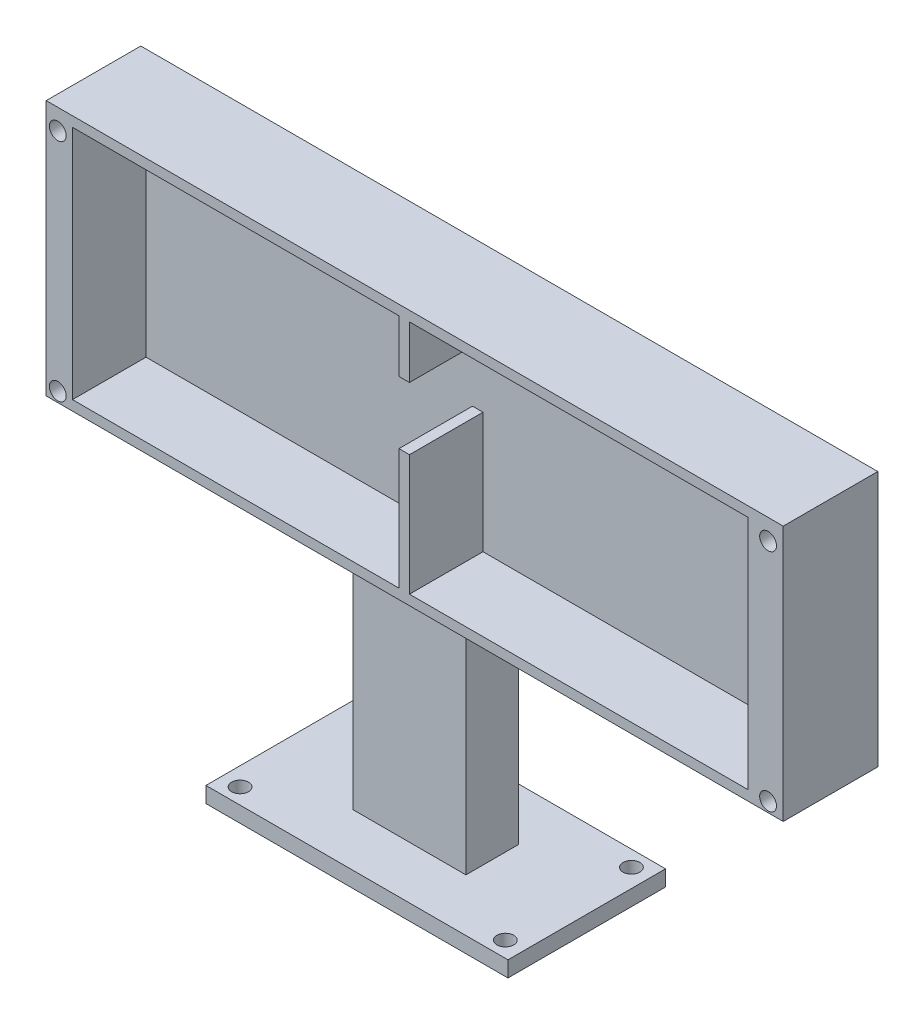
ISO-10303-21;
HEADER;
FILE_DESCRIPTION(('STEP AP214'),'2;1');
FILE_NAME('part.step','',(''),(''),'','','');
FILE_SCHEMA(('AUTOMOTIVE_DESIGN { 1 0 10303 214 1 1 1 1 }'));
ENDSEC;
DATA;
#1=APPLICATION_CONTEXT('core data for automotive mechanical design processes');
#2=APPLICATION_PROTOCOL_DEFINITION('international standard','automotive_design',2000,#1);
#3=PRODUCT_CONTEXT('',#1,'mechanical');
#4=PRODUCT('Part','Part','',(#3));
#5=PRODUCT_RELATED_PRODUCT_CATEGORY('part','',(#4));
#6=PRODUCT_DEFINITION_FORMATION('','',#4);
#7=PRODUCT_DEFINITION_CONTEXT('part definition',#1,'design');
#8=PRODUCT_DEFINITION('design','',#6,#7);
#9=PRODUCT_DEFINITION_SHAPE('','',#8);
#10=(LENGTH_UNIT() NAMED_UNIT(*) SI_UNIT(.MILLI.,.METRE.));
#11=(NAMED_UNIT(*) PLANE_ANGLE_UNIT() SI_UNIT($,.RADIAN.));
#12=(NAMED_UNIT(*) SI_UNIT($,.STERADIAN.) SOLID_ANGLE_UNIT());
#13=UNCERTAINTY_MEASURE_WITH_UNIT(LENGTH_MEASURE(1.E-05),#10,'distance_accuracy_value','');
#14=(GEOMETRIC_REPRESENTATION_CONTEXT(3) GLOBAL_UNCERTAINTY_ASSIGNED_CONTEXT((#13)) GLOBAL_UNIT_ASSIGNED_CONTEXT((#10,
#11,#12)) REPRESENTATION_CONTEXT('',''));
#15=CARTESIAN_POINT('',(0.,0.,0.));
#16=DIRECTION('',(0.,0.,1.));
#17=DIRECTION('',(1.,0.,0.));
#18=AXIS2_PLACEMENT_3D('',#15,#16,#17);
#19=CARTESIAN_POINT('',(0.,0.,-8.));
#20=DIRECTION('',(0.,0.,1.));
#21=DIRECTION('',(1.,0.,0.));
#22=AXIS2_PLACEMENT_3D('',#19,#20,#21);
#23=PLANE('',#22);
#24=DIRECTION('',(1.,0.,0.));
#25=VECTOR('',#24,1.);
#26=CARTESIAN_POINT('',(0.,89.8,-8.));
#27=LINE('',#26,#25);
#28=CARTESIAN_POINT('',(-9.75000000000002,89.8,-8.));
#29=VERTEX_POINT('',#28);
#30=CARTESIAN_POINT('',(54.7155818833901,89.8,-8.));
#31=VERTEX_POINT('',#30);
#32=EDGE_CURVE('E230',#29,#31,#27,.T.);
#33=ORIENTED_EDGE('',*,*,#32,.F.);
#34=DIRECTION('',(0.,-1.,0.));
#35=VECTOR('',#34,1.);
#36=CARTESIAN_POINT('',(-9.75000000000001,0.,-8.));
#37=LINE('',#36,#35);
#38=CARTESIAN_POINT('',(-9.75000000000002,79.8,-8.));
#39=VERTEX_POINT('',#38);
#40=EDGE_CURVE('E378',#29,#39,#37,.T.);
#41=ORIENTED_EDGE('',*,*,#40,.T.);
#42=DIRECTION('',(-1.,0.,0.));
#43=VECTOR('',#42,1.);
#44=CARTESIAN_POINT('',(11.25,79.8,-8.));
#45=LINE('',#44,#43);
#46=CARTESIAN_POINT('',(-11.75,79.8,-8.));
#47=VERTEX_POINT('',#46);
#48=EDGE_CURVE('E318',#39,#47,#45,.T.);
#49=ORIENTED_EDGE('',*,*,#48,.T.);
#50=DIRECTION('',(0.,-1.,0.));
#51=VECTOR('',#50,1.);
#52=CARTESIAN_POINT('',(-11.75,0.,-8.));
#53=LINE('',#52,#51);
#54=CARTESIAN_POINT('',(-11.75,89.8,-8.));
#55=VERTEX_POINT('',#54);
#56=EDGE_CURVE('E362',#55,#47,#53,.T.);
#57=ORIENTED_EDGE('',*,*,#56,.F.);
#58=CARTESIAN_POINT('',(-73.9,89.8,-8.));
#59=VERTEX_POINT('',#58);
#60=EDGE_CURVE('E223',#59,#55,#27,.T.);
#61=ORIENTED_EDGE('',*,*,#60,.F.);
#62=DIRECTION('',(0.,-1.,0.));
#63=VECTOR('',#62,1.);
#64=CARTESIAN_POINT('',(-73.9,0.,-8.));
#65=LINE('',#64,#63);
#66=CARTESIAN_POINT('',(-73.9,44.9,-8.));
#67=VERTEX_POINT('',#66);
#68=EDGE_CURVE('E364',#59,#67,#65,.T.);
#69=ORIENTED_EDGE('',*,*,#68,.T.);
#70=DIRECTION('',(1.,0.,0.));
#71=VECTOR('',#70,1.);
#72=CARTESIAN_POINT('',(0.,44.9,-8.));
#73=LINE('',#72,#71);
#74=CARTESIAN_POINT('',(-11.75,44.9,-8.));
#75=VERTEX_POINT('',#74);
#76=EDGE_CURVE('E368',#67,#75,#73,.T.);
#77=ORIENTED_EDGE('',*,*,#76,.T.);
#78=CARTESIAN_POINT('',(-11.75,67.9,-8.));
#79=VERTEX_POINT('',#78);
#80=EDGE_CURVE('E365',#79,#75,#53,.T.);
#81=ORIENTED_EDGE('',*,*,#80,.F.);
#82=DIRECTION('',(-1.,0.,0.));
#83=VECTOR('',#82,1.);
#84=CARTESIAN_POINT('',(11.25,67.9,-8.));
#85=LINE('',#84,#83);
#86=CARTESIAN_POINT('',(-9.75000000000001,67.9,-8.));
#87=VERTEX_POINT('',#86);
#88=EDGE_CURVE('E65',#87,#79,#85,.T.);
#89=ORIENTED_EDGE('',*,*,#88,.F.);
#90=CARTESIAN_POINT('',(-9.75000000000001,44.9,-8.));
#91=VERTEX_POINT('',#90);
#92=EDGE_CURVE('E361',#87,#91,#37,.T.);
#93=ORIENTED_EDGE('',*,*,#92,.T.);
#94=DIRECTION('',(1.,0.,0.));
#95=VECTOR('',#94,1.);
#96=CARTESIAN_POINT('',(0.,44.9,-8.));
#97=LINE('',#96,#95);
#98=CARTESIAN_POINT('',(54.7155818833901,44.9,-8.));
#99=VERTEX_POINT('',#98);
#100=EDGE_CURVE('E381',#91,#99,#97,.T.);
#101=ORIENTED_EDGE('',*,*,#100,.T.);
#102=DIRECTION('',(0.,-1.,0.));
#103=VECTOR('',#102,1.);
#104=CARTESIAN_POINT('',(54.7155818833901,0.,-8.));
#105=LINE('',#104,#103);
#106=EDGE_CURVE('E273',#31,#99,#105,.T.);
#107=ORIENTED_EDGE('',*,*,#106,.F.);
#108=EDGE_LOOP('',(#33,#41,#49,#57,#61,#69,#77,#81,#89,#93,#101,#107));
#109=FACE_BOUND('',#108,.T.);
#110=ADVANCED_FACE('F40',(#109),#23,.T.);
#111=CARTESIAN_POINT('',(0.,89.8,-8.));
#112=DIRECTION('',(0.,-1.,0.));
#113=DIRECTION('',(0.,0.,-1.));
#114=AXIS2_PLACEMENT_3D('',#111,#112,#113);
#115=PLANE('',#114);
#116=DIRECTION('',(1.,0.,0.));
#117=VECTOR('',#116,1.);
#118=CARTESIAN_POINT('',(0.,89.8,6.));
#119=LINE('',#118,#117);
#120=CARTESIAN_POINT('',(-9.75000000000002,89.8,6.));
#121=VERTEX_POINT('',#120);
#122=CARTESIAN_POINT('',(54.7155818833901,89.8,6.));
#123=VERTEX_POINT('',#122);
#124=EDGE_CURVE('E231',#121,#123,#119,.T.);
#125=ORIENTED_EDGE('',*,*,#124,.F.);
#126=DIRECTION('',(0.,0.,-1.));
#127=VECTOR('',#126,1.);
#128=CARTESIAN_POINT('',(-9.75000000000002,89.8,6.));
#129=LINE('',#128,#127);
#130=EDGE_CURVE('E224',#121,#29,#129,.T.);
#131=ORIENTED_EDGE('',*,*,#130,.T.);
#132=ORIENTED_EDGE('',*,*,#32,.T.);
#133=DIRECTION('',(0.,0.,1.));
#134=VECTOR('',#133,1.);
#135=CARTESIAN_POINT('',(54.7155818833901,89.8,-8.));
#136=LINE('',#135,#134);
#137=EDGE_CURVE('E240',#31,#123,#136,.T.);
#138=ORIENTED_EDGE('',*,*,#137,.T.);
#139=EDGE_LOOP('',(#125,#131,#132,#138));
#140=FACE_BOUND('',#139,.T.);
#141=ADVANCED_FACE('F455',(#140),#115,.T.);
#142=CARTESIAN_POINT('',(54.4,0.,6.));
#143=DIRECTION('',(0.,0.,1.));
#144=DIRECTION('',(1.,0.,0.));
#145=AXIS2_PLACEMENT_3D('',#142,#143,#144);
#146=PLANE('',#145);
#147=DIRECTION('',(0.,1.,0.));
#148=VECTOR('',#147,1.);
#149=CARTESIAN_POINT('',(-9.75000000000001,0.,6.));
#150=LINE('',#149,#148);
#151=CARTESIAN_POINT('',(-9.75000000000002,79.8,6.));
#152=VERTEX_POINT('',#151);
#153=EDGE_CURVE('E57',#152,#121,#150,.T.);
#154=ORIENTED_EDGE('',*,*,#153,.T.);
#155=ORIENTED_EDGE('',*,*,#124,.T.);
#156=DIRECTION('',(0.,-1.,0.));
#157=VECTOR('',#156,1.);
#158=CARTESIAN_POINT('',(54.7155818833901,0.,6.));
#159=LINE('',#158,#157);
#160=CARTESIAN_POINT('',(54.7155818833901,44.9,6.));
#161=VERTEX_POINT('',#160);
#162=EDGE_CURVE('E277',#123,#161,#159,.T.);
#163=ORIENTED_EDGE('',*,*,#162,.T.);
#164=DIRECTION('',(-1.,0.,0.));
#165=VECTOR('',#164,1.);
#166=CARTESIAN_POINT('',(0.,44.9,6.));
#167=LINE('',#166,#165);
#168=CARTESIAN_POINT('',(-9.75000000000001,44.9,6.));
#169=VERTEX_POINT('',#168);
#170=EDGE_CURVE('E339',#161,#169,#167,.T.);
#171=ORIENTED_EDGE('',*,*,#170,.T.);
#172=CARTESIAN_POINT('',(-9.75000000000001,67.9,6.));
#173=VERTEX_POINT('',#172);
#174=EDGE_CURVE('E336',#169,#173,#150,.T.);
#175=ORIENTED_EDGE('',*,*,#174,.T.);
#176=DIRECTION('',(-1.,0.,0.));
#177=VECTOR('',#176,1.);
#178=CARTESIAN_POINT('',(11.25,67.9,6.));
#179=LINE('',#178,#177);
#180=CARTESIAN_POINT('',(-11.75,67.9,6.));
#181=VERTEX_POINT('',#180);
#182=EDGE_CURVE('E323',#173,#181,#179,.T.);
#183=ORIENTED_EDGE('',*,*,#182,.T.);
#184=DIRECTION('',(0.,1.,0.));
#185=VECTOR('',#184,1.);
#186=CARTESIAN_POINT('',(-11.75,0.,6.));
#187=LINE('',#186,#185);
#188=CARTESIAN_POINT('',(-11.75,44.9,6.));
#189=VERTEX_POINT('',#188);
#190=EDGE_CURVE('E213',#189,#181,#187,.T.);
#191=ORIENTED_EDGE('',*,*,#190,.F.);
#192=DIRECTION('',(-1.,0.,0.));
#193=VECTOR('',#192,1.);
#194=CARTESIAN_POINT('',(0.,44.9,6.));
#195=LINE('',#194,#193);
#196=CARTESIAN_POINT('',(-73.9,44.9,6.));
#197=VERTEX_POINT('',#196);
#198=EDGE_CURVE('E214',#189,#197,#195,.T.);
#199=ORIENTED_EDGE('',*,*,#198,.T.);
#200=DIRECTION('',(0.,1.,0.));
#201=VECTOR('',#200,1.);
#202=CARTESIAN_POINT('',(-73.9,0.,6.));
#203=LINE('',#202,#201);
#204=CARTESIAN_POINT('',(-73.9,89.8,6.));
#205=VERTEX_POINT('',#204);
#206=EDGE_CURVE('E229',#197,#205,#203,.T.);
#207=ORIENTED_EDGE('',*,*,#206,.T.);
#208=CARTESIAN_POINT('',(-11.75,89.8,6.));
#209=VERTEX_POINT('',#208);
#210=EDGE_CURVE('E220',#205,#209,#119,.T.);
#211=ORIENTED_EDGE('',*,*,#210,.T.);
#212=CARTESIAN_POINT('',(-11.75,79.8,6.));
#213=VERTEX_POINT('',#212);
#214=EDGE_CURVE('E204',#213,#209,#187,.T.);
#215=ORIENTED_EDGE('',*,*,#214,.F.);
#216=DIRECTION('',(-1.,0.,0.));
#217=VECTOR('',#216,1.);
#218=CARTESIAN_POINT('',(11.25,79.8,6.));
#219=LINE('',#218,#217);
#220=EDGE_CURVE('E321',#152,#213,#219,.T.);
#221=ORIENTED_EDGE('',*,*,#220,.F.);
#222=EDGE_LOOP('',(#154,#155,#163,#171,#175,#183,#191,#199,#207,#211,#215,#221));
#223=FACE_BOUND('',#222,.T.);
#224=CARTESIAN_POINT('',(-76.7,44.9,6.));
#225=DIRECTION('',(0.,0.,1.));
#226=DIRECTION('',(1.,0.,0.));
#227=AXIS2_PLACEMENT_3D('',#224,#225,#226);
#228=CIRCLE('',#227,1.60000000000001);
#229=CARTESIAN_POINT('',(-75.1,44.9,6.));
#230=VERTEX_POINT('',#229);
#231=EDGE_CURVE('E245',#230,#230,#228,.T.);
#232=ORIENTED_EDGE('',*,*,#231,.F.);
#233=EDGE_LOOP('',(#232));
#234=FACE_BOUND('',#233,.T.);
#235=CARTESIAN_POINT('',(-76.7,87.8,6.));
#236=DIRECTION('',(0.,0.,1.));
#237=DIRECTION('',(1.,0.,0.));
#238=AXIS2_PLACEMENT_3D('',#235,#236,#237);
#239=CIRCLE('',#238,1.60000000000001);
#240=CARTESIAN_POINT('',(-75.1,87.8,6.));
#241=VERTEX_POINT('',#240);
#242=EDGE_CURVE('E251',#241,#241,#239,.T.);
#243=ORIENTED_EDGE('',*,*,#242,.F.);
#244=EDGE_LOOP('',(#243));
#245=FACE_BOUND('',#244,.T.);
#246=CARTESIAN_POINT('',(58.5138567896386,87.8,6.));
#247=DIRECTION('',(0.,0.,1.));
#248=DIRECTION('',(1.,0.,0.));
#249=AXIS2_PLACEMENT_3D('',#246,#247,#248);
#250=CIRCLE('',#249,1.6);
#251=CARTESIAN_POINT('',(60.1138567896386,87.8,6.));
#252=VERTEX_POINT('',#251);
#253=EDGE_CURVE('E286',#252,#252,#250,.T.);
#254=ORIENTED_EDGE('',*,*,#253,.F.);
#255=EDGE_LOOP('',(#254));
#256=FACE_BOUND('',#255,.T.);
#257=CARTESIAN_POINT('',(58.5157389797229,44.9,6.));
#258=DIRECTION('',(0.,0.,1.));
#259=DIRECTION('',(1.,0.,0.));
#260=AXIS2_PLACEMENT_3D('',#257,#258,#259);
#261=CIRCLE('',#260,1.6);
#262=CARTESIAN_POINT('',(60.1157389797229,44.9,6.));
#263=VERTEX_POINT('',#262);
#264=EDGE_CURVE('E271',#263,#263,#261,.T.);
#265=ORIENTED_EDGE('',*,*,#264,.F.);
#266=EDGE_LOOP('',(#265));
#267=FACE_BOUND('',#266,.T.);
#268=DIRECTION('',(0.,1.,0.));
#269=VECTOR('',#268,1.);
#270=CARTESIAN_POINT('',(61.4,43.,6.));
#271=LINE('',#270,#269);
#272=CARTESIAN_POINT('',(61.4,43.,6.));
#273=VERTEX_POINT('',#272);
#274=CARTESIAN_POINT('',(61.4,91.7,6.));
#275=VERTEX_POINT('',#274);
#276=EDGE_CURVE('E296',#273,#275,#271,.T.);
#277=ORIENTED_EDGE('',*,*,#276,.T.);
#278=DIRECTION('',(1.,0.,0.));
#279=VECTOR('',#278,1.);
#280=CARTESIAN_POINT('',(0.,91.7,6.));
#281=LINE('',#280,#279);
#282=CARTESIAN_POINT('',(-78.9,91.7,6.));
#283=VERTEX_POINT('',#282);
#284=EDGE_CURVE('E239',#283,#275,#281,.T.);
#285=ORIENTED_EDGE('',*,*,#284,.F.);
#286=DIRECTION('',(0.,1.,0.));
#287=VECTOR('',#286,1.);
#288=CARTESIAN_POINT('',(-78.9,43.,6.));
#289=LINE('',#288,#287);
#290=CARTESIAN_POINT('',(-78.9,43.,6.));
#291=VERTEX_POINT('',#290);
#292=EDGE_CURVE('E269',#291,#283,#289,.T.);
#293=ORIENTED_EDGE('',*,*,#292,.F.);
#294=DIRECTION('',(-1.,0.,0.));
#295=VECTOR('',#294,1.);
#296=CARTESIAN_POINT('',(54.4,43.,6.));
#297=LINE('',#296,#295);
#298=EDGE_CURVE('E331',#273,#291,#297,.T.);
#299=ORIENTED_EDGE('',*,*,#298,.F.);
#300=EDGE_LOOP('',(#277,#285,#293,#299));
#301=FACE_BOUND('',#300,.T.);
#302=ADVANCED_FACE('F226',(#223,#234,#245,#256,#267,#301),#146,.T.);
#303=CARTESIAN_POINT('',(0.,43.,15.));
#304=DIRECTION('',(0.,1.,0.));
#305=DIRECTION('',(0.,0.,1.));
#306=AXIS2_PLACEMENT_3D('',#303,#304,#305);
#307=PLANE('',#306);
#308=DIRECTION('',(0.,0.,-1.));
#309=VECTOR('',#308,1.);
#310=CARTESIAN_POINT('',(0.,43.,15.));
#311=LINE('',#310,#309);
#312=CARTESIAN_POINT('',(0.,43.,5.));
#313=VERTEX_POINT('',#312);
#314=CARTESIAN_POINT('',(0.,43.,-5.));
#315=VERTEX_POINT('',#314);
#316=EDGE_CURVE('E413',#313,#315,#311,.T.);
#317=ORIENTED_EDGE('',*,*,#316,.T.);
#318=DIRECTION('',(-1.,0.,0.));
#319=VECTOR('',#318,1.);
#320=CARTESIAN_POINT('',(54.4,43.,-5.));
#321=LINE('',#320,#319);
#322=CARTESIAN_POINT('',(-21.5,43.,-5.));
#323=VERTEX_POINT('',#322);
#324=EDGE_CURVE('E342',#315,#323,#321,.T.);
#325=ORIENTED_EDGE('',*,*,#324,.T.);
#326=DIRECTION('',(0.,0.,-1.));
#327=VECTOR('',#326,1.);
#328=CARTESIAN_POINT('',(-21.5,43.,15.));
#329=LINE('',#328,#327);
#330=CARTESIAN_POINT('',(-21.5,43.,5.));
#331=VERTEX_POINT('',#330);
#332=EDGE_CURVE('E410',#331,#323,#329,.T.);
#333=ORIENTED_EDGE('',*,*,#332,.F.);
#334=DIRECTION('',(-1.,0.,0.));
#335=VECTOR('',#334,1.);
#336=CARTESIAN_POINT('',(54.4,43.,5.));
#337=LINE('',#336,#335);
#338=EDGE_CURVE('E353',#313,#331,#337,.T.);
#339=ORIENTED_EDGE('',*,*,#338,.F.);
#340=EDGE_LOOP('',(#317,#325,#333,#339));
#341=FACE_BOUND('',#340,.T.);
#342=DIRECTION('',(-1.,0.,0.));
#343=VECTOR('',#342,1.);
#344=CARTESIAN_POINT('',(54.4,43.,-12.));
#345=LINE('',#344,#343);
#346=CARTESIAN_POINT('',(61.4,43.,-12.));
#347=VERTEX_POINT('',#346);
#348=CARTESIAN_POINT('',(-78.9,43.,-12.));
#349=VERTEX_POINT('',#348);
#350=EDGE_CURVE('E299',#347,#349,#345,.T.);
#351=ORIENTED_EDGE('',*,*,#350,.F.);
#352=DIRECTION('',(0.,0.,-1.));
#353=VECTOR('',#352,1.);
#354=CARTESIAN_POINT('',(61.4,43.,-12.));
#355=LINE('',#354,#353);
#356=EDGE_CURVE('E283',#273,#347,#355,.T.);
#357=ORIENTED_EDGE('',*,*,#356,.F.);
#358=ORIENTED_EDGE('',*,*,#298,.T.);
#359=DIRECTION('',(0.,0.,1.));
#360=VECTOR('',#359,1.);
#361=CARTESIAN_POINT('',(-78.9,43.,-12.));
#362=LINE('',#361,#360);
#363=EDGE_CURVE('E263',#349,#291,#362,.T.);
#364=ORIENTED_EDGE('',*,*,#363,.F.);
#365=EDGE_LOOP('',(#351,#357,#358,#364));
#366=FACE_BOUND('',#365,.T.);
#367=ADVANCED_FACE('F507',(#341,#366),#307,.F.);
#368=CARTESIAN_POINT('',(-9.75000000000001,0.,-8.));
#369=DIRECTION('',(-1.,0.,0.));
#370=DIRECTION('',(0.,-1.,0.));
#371=AXIS2_PLACEMENT_3D('',#368,#369,#370);
#372=PLANE('',#371);
#373=DIRECTION('',(0.,0.,1.));
#374=VECTOR('',#373,1.);
#375=CARTESIAN_POINT('',(-9.75000000000002,79.8,-8.));
#376=LINE('',#375,#374);
#377=EDGE_CURVE('E329',#39,#152,#376,.T.);
#378=ORIENTED_EDGE('',*,*,#377,.F.);
#379=ORIENTED_EDGE('',*,*,#40,.F.);
#380=ORIENTED_EDGE('',*,*,#130,.F.);
#381=ORIENTED_EDGE('',*,*,#153,.F.);
#382=EDGE_LOOP('',(#378,#379,#380,#381));
#383=FACE_BOUND('',#382,.T.);
#384=ADVANCED_FACE('F490',(#383),#372,.F.);
#385=CARTESIAN_POINT('',(-11.75,0.,-8.));
#386=DIRECTION('',(-1.,0.,0.));
#387=DIRECTION('',(0.,-1.,0.));
#388=AXIS2_PLACEMENT_3D('',#385,#386,#387);
#389=PLANE('',#388);
#390=ORIENTED_EDGE('',*,*,#56,.T.);
#391=DIRECTION('',(0.,0.,1.));
#392=VECTOR('',#391,1.);
#393=CARTESIAN_POINT('',(-11.75,79.8,0.));
#394=LINE('',#393,#392);
#395=EDGE_CURVE('E211',#47,#213,#394,.T.);
#396=ORIENTED_EDGE('',*,*,#395,.T.);
#397=ORIENTED_EDGE('',*,*,#214,.T.);
#398=DIRECTION('',(0.,0.,-1.));
#399=VECTOR('',#398,1.);
#400=CARTESIAN_POINT('',(-11.75,89.8,6.));
#401=LINE('',#400,#399);
#402=EDGE_CURVE('E208',#209,#55,#401,.T.);
#403=ORIENTED_EDGE('',*,*,#402,.T.);
#404=EDGE_LOOP('',(#390,#396,#397,#403));
#405=FACE_BOUND('',#404,.T.);
#406=ADVANCED_FACE('F207',(#405),#389,.T.);
#407=CARTESIAN_POINT('',(0.,0.,-15.));
#408=DIRECTION('',(0.,0.,1.));
#409=DIRECTION('',(1.,0.,0.));
#410=AXIS2_PLACEMENT_3D('',#407,#408,#409);
#411=PLANE('',#410);
#412=DIRECTION('',(-1.,0.,0.));
#413=VECTOR('',#412,1.);
#414=CARTESIAN_POINT('',(0.,3.,-15.));
#415=LINE('',#414,#413);
#416=CARTESIAN_POINT('',(18.,3.00000000000001,-15.));
#417=VERTEX_POINT('',#416);
#418=CARTESIAN_POINT('',(-39.5,3.,-15.));
#419=VERTEX_POINT('',#418);
#420=EDGE_CURVE('E390',#417,#419,#415,.T.);
#421=ORIENTED_EDGE('',*,*,#420,.F.);
#422=DIRECTION('',(0.,1.,0.));
#423=VECTOR('',#422,1.);
#424=CARTESIAN_POINT('',(18.,0.,-15.));
#425=LINE('',#424,#423);
#426=CARTESIAN_POINT('',(18.,0.,-15.));
#427=VERTEX_POINT('',#426);
#428=EDGE_CURVE('E401',#427,#417,#425,.T.);
#429=ORIENTED_EDGE('',*,*,#428,.F.);
#430=DIRECTION('',(1.,0.,0.));
#431=VECTOR('',#430,1.);
#432=CARTESIAN_POINT('',(0.,0.,-15.));
#433=LINE('',#432,#431);
#434=CARTESIAN_POINT('',(-39.5,0.,-15.));
#435=VERTEX_POINT('',#434);
#436=EDGE_CURVE('E399',#435,#427,#433,.T.);
#437=ORIENTED_EDGE('',*,*,#436,.F.);
#438=DIRECTION('',(0.,1.,0.));
#439=VECTOR('',#438,1.);
#440=CARTESIAN_POINT('',(-39.5,0.,-15.));
#441=LINE('',#440,#439);
#442=EDGE_CURVE('E375',#435,#419,#441,.T.);
#443=ORIENTED_EDGE('',*,*,#442,.T.);
#444=EDGE_LOOP('',(#421,#429,#437,#443));
#445=FACE_BOUND('',#444,.T.);
#446=ADVANCED_FACE('F496',(#445),#411,.F.);
#447=CARTESIAN_POINT('',(0.,0.,15.));
#448=DIRECTION('',(-1.,0.,0.));
#449=DIRECTION('',(0.,0.,1.));
#450=AXIS2_PLACEMENT_3D('',#447,#448,#449);
#451=PLANE('',#450);
#452=DIRECTION('',(0.,0.,-1.));
#453=VECTOR('',#452,1.);
#454=CARTESIAN_POINT('',(0.,3.00000000000001,15.));
#455=LINE('',#454,#453);
#456=CARTESIAN_POINT('',(0.,3.00000000000001,5.));
#457=VERTEX_POINT('',#456);
#458=CARTESIAN_POINT('',(0.,3.,-5.));
#459=VERTEX_POINT('',#458);
#460=EDGE_CURVE('E416',#457,#459,#455,.T.);
#461=ORIENTED_EDGE('',*,*,#460,.T.);
#462=DIRECTION('',(0.,1.,0.));
#463=VECTOR('',#462,1.);
#464=CARTESIAN_POINT('',(0.,0.,-5.));
#465=LINE('',#464,#463);
#466=EDGE_CURVE('E349',#459,#315,#465,.T.);
#467=ORIENTED_EDGE('',*,*,#466,.T.);
#468=ORIENTED_EDGE('',*,*,#316,.F.);
#469=DIRECTION('',(0.,1.,0.));
#470=VECTOR('',#469,1.);
#471=CARTESIAN_POINT('',(0.,0.,5.));
#472=LINE('',#471,#470);
#473=EDGE_CURVE('E359',#457,#313,#472,.T.);
#474=ORIENTED_EDGE('',*,*,#473,.F.);
#475=EDGE_LOOP('',(#461,#467,#468,#474));
#476=FACE_BOUND('',#475,.T.);
#477=ADVANCED_FACE('F499',(#476),#451,.F.);
#478=CARTESIAN_POINT('',(-21.5,0.,15.));
#479=DIRECTION('',(1.,0.,0.));
#480=DIRECTION('',(0.,1.,0.));
#481=AXIS2_PLACEMENT_3D('',#478,#479,#480);
#482=PLANE('',#481);
#483=ORIENTED_EDGE('',*,*,#332,.T.);
#484=DIRECTION('',(0.,-1.,0.));
#485=VECTOR('',#484,1.);
#486=CARTESIAN_POINT('',(-21.5,0.,-5.));
#487=LINE('',#486,#485);
#488=CARTESIAN_POINT('',(-21.5,3.,-5.));
#489=VERTEX_POINT('',#488);
#490=EDGE_CURVE('E345',#323,#489,#487,.T.);
#491=ORIENTED_EDGE('',*,*,#490,.T.);
#492=DIRECTION('',(0.,0.,-1.));
#493=VECTOR('',#492,1.);
#494=CARTESIAN_POINT('',(-21.5,3.,15.));
#495=LINE('',#494,#493);
#496=CARTESIAN_POINT('',(-21.5,3.,5.));
#497=VERTEX_POINT('',#496);
#498=EDGE_CURVE('E407',#497,#489,#495,.T.);
#499=ORIENTED_EDGE('',*,*,#498,.F.);
#500=DIRECTION('',(0.,-1.,0.));
#501=VECTOR('',#500,1.);
#502=CARTESIAN_POINT('',(-21.5,0.,5.));
#503=LINE('',#502,#501);
#504=EDGE_CURVE('E355',#331,#497,#503,.T.);
#505=ORIENTED_EDGE('',*,*,#504,.F.);
#506=EDGE_LOOP('',(#483,#491,#499,#505));
#507=FACE_BOUND('',#506,.T.);
#508=ADVANCED_FACE('F494',(#507),#482,.F.);
#509=CARTESIAN_POINT('',(0.,0.,15.));
#510=DIRECTION('',(0.,0.,1.));
#511=DIRECTION('',(1.,0.,0.));
#512=AXIS2_PLACEMENT_3D('',#509,#510,#511);
#513=PLANE('',#512);
#514=DIRECTION('',(-1.,0.,0.));
#515=VECTOR('',#514,1.);
#516=CARTESIAN_POINT('',(0.,3.00000000000001,15.));
#517=LINE('',#516,#515);
#518=CARTESIAN_POINT('',(18.,3.00000000000001,15.));
#519=VERTEX_POINT('',#518);
#520=CARTESIAN_POINT('',(-39.5,3.,15.));
#521=VERTEX_POINT('',#520);
#522=EDGE_CURVE('E394',#519,#521,#517,.T.);
#523=ORIENTED_EDGE('',*,*,#522,.T.);
#524=DIRECTION('',(0.,1.,0.));
#525=VECTOR('',#524,1.);
#526=CARTESIAN_POINT('',(-39.5,0.,15.));
#527=LINE('',#526,#525);
#528=CARTESIAN_POINT('',(-39.5,0.,15.));
#529=VERTEX_POINT('',#528);
#530=EDGE_CURVE('E386',#529,#521,#527,.T.);
#531=ORIENTED_EDGE('',*,*,#530,.F.);
#532=DIRECTION('',(1.,0.,0.));
#533=VECTOR('',#532,1.);
#534=CARTESIAN_POINT('',(0.,0.,15.));
#535=LINE('',#534,#533);
#536=CARTESIAN_POINT('',(18.,0.,15.));
#537=VERTEX_POINT('',#536);
#538=EDGE_CURVE('E389',#529,#537,#535,.T.);
#539=ORIENTED_EDGE('',*,*,#538,.T.);
#540=DIRECTION('',(0.,1.,0.));
#541=VECTOR('',#540,1.);
#542=CARTESIAN_POINT('',(18.,0.,15.));
#543=LINE('',#542,#541);
#544=EDGE_CURVE('E392',#537,#519,#543,.T.);
#545=ORIENTED_EDGE('',*,*,#544,.T.);
#546=EDGE_LOOP('',(#523,#531,#539,#545));
#547=FACE_BOUND('',#546,.T.);
#548=ADVANCED_FACE('F491',(#547),#513,.T.);
#549=CARTESIAN_POINT('',(-39.5,0.,15.));
#550=DIRECTION('',(-1.,0.,0.));
#551=DIRECTION('',(0.,0.,1.));
#552=AXIS2_PLACEMENT_3D('',#549,#550,#551);
#553=PLANE('',#552);
#554=ORIENTED_EDGE('',*,*,#442,.F.);
#555=DIRECTION('',(0.,0.,-1.));
#556=VECTOR('',#555,1.);
#557=CARTESIAN_POINT('',(-39.5,0.,15.));
#558=LINE('',#557,#556);
#559=EDGE_CURVE('E11',#529,#435,#558,.T.);
#560=ORIENTED_EDGE('',*,*,#559,.F.);
#561=ORIENTED_EDGE('',*,*,#530,.T.);
#562=DIRECTION('',(0.,0.,-1.));
#563=VECTOR('',#562,1.);
#564=CARTESIAN_POINT('',(-39.5,3.,15.));
#565=LINE('',#564,#563);
#566=EDGE_CURVE('E396',#521,#419,#565,.T.);
#567=ORIENTED_EDGE('',*,*,#566,.T.);
#568=EDGE_LOOP('',(#554,#560,#561,#567));
#569=FACE_BOUND('',#568,.T.);
#570=ADVANCED_FACE('F42',(#569),#553,.T.);
#571=CARTESIAN_POINT('',(0.,0.,15.));
#572=DIRECTION('',(0.,1.,0.));
#573=DIRECTION('',(0.,0.,1.));
#574=AXIS2_PLACEMENT_3D('',#571,#572,#573);
#575=PLANE('',#574);
#576=CARTESIAN_POINT('',(-36.,0.,-12.));
#577=DIRECTION('',(0.,-1.,0.));
#578=DIRECTION('',(0.,0.,-1.));
#579=AXIS2_PLACEMENT_3D('',#576,#577,#578);
#580=CIRCLE('',#579,1.6);
#581=CARTESIAN_POINT('',(-36.,0.,-13.6));
#582=VERTEX_POINT('',#581);
#583=EDGE_CURVE('E306',#582,#582,#580,.T.);
#584=ORIENTED_EDGE('',*,*,#583,.F.);
#585=EDGE_LOOP('',(#584));
#586=FACE_BOUND('',#585,.T.);
#587=CARTESIAN_POINT('',(14.5,0.,12.));
#588=DIRECTION('',(0.,-1.,0.));
#589=DIRECTION('',(0.,0.,-1.));
#590=AXIS2_PLACEMENT_3D('',#587,#588,#589);
#591=CIRCLE('',#590,1.6);
#592=CARTESIAN_POINT('',(14.5,0.,10.4));
#593=VERTEX_POINT('',#592);
#594=EDGE_CURVE('E305',#593,#593,#591,.T.);
#595=ORIENTED_EDGE('',*,*,#594,.F.);
#596=EDGE_LOOP('',(#595));
#597=FACE_BOUND('',#596,.T.);
#598=CARTESIAN_POINT('',(14.5,0.,-12.));
#599=DIRECTION('',(0.,-1.,0.));
#600=DIRECTION('',(0.,0.,-1.));
#601=AXIS2_PLACEMENT_3D('',#598,#599,#600);
#602=CIRCLE('',#601,1.6);
#603=CARTESIAN_POINT('',(14.5,0.,-13.6));
#604=VERTEX_POINT('',#603);
#605=EDGE_CURVE('E302',#604,#604,#602,.T.);
#606=ORIENTED_EDGE('',*,*,#605,.F.);
#607=EDGE_LOOP('',(#606));
#608=FACE_BOUND('',#607,.T.);
#609=CARTESIAN_POINT('',(-36.,0.,12.));
#610=DIRECTION('',(0.,-1.,0.));
#611=DIRECTION('',(0.,0.,-1.));
#612=AXIS2_PLACEMENT_3D('',#609,#610,#611);
#613=CIRCLE('',#612,1.6);
#614=CARTESIAN_POINT('',(-36.,0.,10.4));
#615=VERTEX_POINT('',#614);
#616=EDGE_CURVE('E309',#615,#615,#613,.T.);
#617=ORIENTED_EDGE('',*,*,#616,.F.);
#618=EDGE_LOOP('',(#617));
#619=FACE_BOUND('',#618,.T.);
#620=ORIENTED_EDGE('',*,*,#436,.T.);
#621=DIRECTION('',(0.,0.,-1.));
#622=VECTOR('',#621,1.);
#623=CARTESIAN_POINT('',(18.,0.,15.));
#624=LINE('',#623,#622);
#625=EDGE_CURVE('E49',#537,#427,#624,.T.);
#626=ORIENTED_EDGE('',*,*,#625,.F.);
#627=ORIENTED_EDGE('',*,*,#538,.F.);
#628=ORIENTED_EDGE('',*,*,#559,.T.);
#629=EDGE_LOOP('',(#620,#626,#627,#628));
#630=FACE_BOUND('',#629,.T.);
#631=ADVANCED_FACE('F515',(#586,#597,#608,#619,#630),#575,.F.);
#632=CARTESIAN_POINT('',(18.,0.,15.));
#633=DIRECTION('',(-1.,0.,0.));
#634=DIRECTION('',(0.,0.,1.));
#635=AXIS2_PLACEMENT_3D('',#632,#633,#634);
#636=PLANE('',#635);
#637=ORIENTED_EDGE('',*,*,#428,.T.);
#638=DIRECTION('',(0.,0.,-1.));
#639=VECTOR('',#638,1.);
#640=CARTESIAN_POINT('',(18.,3.00000000000001,15.));
#641=LINE('',#640,#639);
#642=EDGE_CURVE('E419',#519,#417,#641,.T.);
#643=ORIENTED_EDGE('',*,*,#642,.F.);
#644=ORIENTED_EDGE('',*,*,#544,.F.);
#645=ORIENTED_EDGE('',*,*,#625,.T.);
#646=EDGE_LOOP('',(#637,#643,#644,#645));
#647=FACE_BOUND('',#646,.T.);
#648=ADVANCED_FACE('F503',(#647),#636,.F.);
#649=CARTESIAN_POINT('',(0.,3.,15.));
#650=DIRECTION('',(0.,-1.,0.));
#651=DIRECTION('',(1.,0.,0.));
#652=AXIS2_PLACEMENT_3D('',#649,#650,#651);
#653=PLANE('',#652);
#654=CARTESIAN_POINT('',(-36.,3.,-12.));
#655=DIRECTION('',(0.,-1.,0.));
#656=DIRECTION('',(1.,0.,0.));
#657=AXIS2_PLACEMENT_3D('',#654,#655,#656);
#658=CIRCLE('',#657,1.6);
#659=CARTESIAN_POINT('',(-34.4,3.,-12.));
#660=VERTEX_POINT('',#659);
#661=EDGE_CURVE('E44',#660,#660,#658,.T.);
#662=ORIENTED_EDGE('',*,*,#661,.T.);
#663=EDGE_LOOP('',(#662));
#664=FACE_BOUND('',#663,.T.);
#665=CARTESIAN_POINT('',(14.5,3.00000000000001,12.));
#666=DIRECTION('',(0.,-1.,0.));
#667=DIRECTION('',(1.,0.,0.));
#668=AXIS2_PLACEMENT_3D('',#665,#666,#667);
#669=CIRCLE('',#668,1.6);
#670=CARTESIAN_POINT('',(16.1,3.00000000000001,12.));
#671=VERTEX_POINT('',#670);
#672=EDGE_CURVE('E427',#671,#671,#669,.T.);
#673=ORIENTED_EDGE('',*,*,#672,.T.);
#674=EDGE_LOOP('',(#673));
#675=FACE_BOUND('',#674,.T.);
#676=CARTESIAN_POINT('',(14.5,3.00000000000001,-12.));
#677=DIRECTION('',(0.,-1.,0.));
#678=DIRECTION('',(1.,0.,0.));
#679=AXIS2_PLACEMENT_3D('',#676,#677,#678);
#680=CIRCLE('',#679,1.6);
#681=CARTESIAN_POINT('',(16.1,3.00000000000001,-12.));
#682=VERTEX_POINT('',#681);
#683=EDGE_CURVE('E425',#682,#682,#680,.T.);
#684=ORIENTED_EDGE('',*,*,#683,.T.);
#685=EDGE_LOOP('',(#684));
#686=FACE_BOUND('',#685,.T.);
#687=CARTESIAN_POINT('',(-36.,3.,12.));
#688=DIRECTION('',(0.,-1.,0.));
#689=DIRECTION('',(1.,0.,0.));
#690=AXIS2_PLACEMENT_3D('',#687,#688,#689);
#691=CIRCLE('',#690,1.6);
#692=CARTESIAN_POINT('',(-34.4,3.,12.));
#693=VERTEX_POINT('',#692);
#694=EDGE_CURVE('E314',#693,#693,#691,.T.);
#695=ORIENTED_EDGE('',*,*,#694,.T.);
#696=EDGE_LOOP('',(#695));
#697=FACE_BOUND('',#696,.T.);
#698=DIRECTION('',(-1.,0.,0.));
#699=VECTOR('',#698,1.);
#700=CARTESIAN_POINT('',(54.4,3.00000000000001,-5.));
#701=LINE('',#700,#699);
#702=EDGE_CURVE('E341',#459,#489,#701,.T.);
#703=ORIENTED_EDGE('',*,*,#702,.F.);
#704=ORIENTED_EDGE('',*,*,#460,.F.);
#705=DIRECTION('',(-1.,0.,0.));
#706=VECTOR('',#705,1.);
#707=CARTESIAN_POINT('',(54.4,3.00000000000002,5.));
#708=LINE('',#707,#706);
#709=EDGE_CURVE('E352',#457,#497,#708,.T.);
#710=ORIENTED_EDGE('',*,*,#709,.T.);
#711=ORIENTED_EDGE('',*,*,#498,.T.);
#712=EDGE_LOOP('',(#703,#704,#710,#711));
#713=FACE_BOUND('',#712,.T.);
#714=ORIENTED_EDGE('',*,*,#642,.T.);
#715=ORIENTED_EDGE('',*,*,#420,.T.);
#716=ORIENTED_EDGE('',*,*,#566,.F.);
#717=ORIENTED_EDGE('',*,*,#522,.F.);
#718=EDGE_LOOP('',(#714,#715,#716,#717));
#719=FACE_BOUND('',#718,.T.);
#720=ADVANCED_FACE('F434',(#664,#675,#686,#697,#713,#719),#653,.F.);
#721=CARTESIAN_POINT('',(54.4,0.,5.));
#722=DIRECTION('',(0.,0.,1.));
#723=DIRECTION('',(0.,-1.,0.));
#724=AXIS2_PLACEMENT_3D('',#721,#722,#723);
#725=PLANE('',#724);
#726=ORIENTED_EDGE('',*,*,#473,.T.);
#727=ORIENTED_EDGE('',*,*,#338,.T.);
#728=ORIENTED_EDGE('',*,*,#504,.T.);
#729=ORIENTED_EDGE('',*,*,#709,.F.);
#730=EDGE_LOOP('',(#726,#727,#728,#729));
#731=FACE_BOUND('',#730,.T.);
#732=ADVANCED_FACE('F467',(#731),#725,.T.);
#733=CARTESIAN_POINT('',(54.4,0.,-5.));
#734=DIRECTION('',(0.,0.,1.));
#735=DIRECTION('',(0.,-1.,0.));
#736=AXIS2_PLACEMENT_3D('',#733,#734,#735);
#737=PLANE('',#736);
#738=ORIENTED_EDGE('',*,*,#702,.T.);
#739=ORIENTED_EDGE('',*,*,#490,.F.);
#740=ORIENTED_EDGE('',*,*,#324,.F.);
#741=ORIENTED_EDGE('',*,*,#466,.F.);
#742=EDGE_LOOP('',(#738,#739,#740,#741));
#743=FACE_BOUND('',#742,.T.);
#744=ADVANCED_FACE('F488',(#743),#737,.F.);
#745=ORIENTED_EDGE('',*,*,#92,.F.);
#746=DIRECTION('',(0.,0.,1.));
#747=VECTOR('',#746,1.);
#748=CARTESIAN_POINT('',(-9.75000000000001,67.9,-8.));
#749=LINE('',#748,#747);
#750=EDGE_CURVE('E320',#87,#173,#749,.T.);
#751=ORIENTED_EDGE('',*,*,#750,.T.);
#752=ORIENTED_EDGE('',*,*,#174,.F.);
#753=DIRECTION('',(0.,0.,1.));
#754=VECTOR('',#753,1.);
#755=CARTESIAN_POINT('',(-9.75000000000001,44.9,-8.));
#756=LINE('',#755,#754);
#757=EDGE_CURVE('E383',#91,#169,#756,.T.);
#758=ORIENTED_EDGE('',*,*,#757,.F.);
#759=EDGE_LOOP('',(#745,#751,#752,#758));
#760=FACE_BOUND('',#759,.T.);
#761=ADVANCED_FACE('F484',(#760),#372,.F.);
#762=CARTESIAN_POINT('',(0.,44.9,-8.));
#763=DIRECTION('',(0.,-1.,0.));
#764=DIRECTION('',(0.,0.,-1.));
#765=AXIS2_PLACEMENT_3D('',#762,#763,#764);
#766=PLANE('',#765);
#767=ORIENTED_EDGE('',*,*,#170,.F.);
#768=DIRECTION('',(0.,0.,1.));
#769=VECTOR('',#768,1.);
#770=CARTESIAN_POINT('',(54.7155818833901,44.9,-8.));
#771=LINE('',#770,#769);
#772=EDGE_CURVE('E276',#99,#161,#771,.T.);
#773=ORIENTED_EDGE('',*,*,#772,.F.);
#774=ORIENTED_EDGE('',*,*,#100,.F.);
#775=ORIENTED_EDGE('',*,*,#757,.T.);
#776=EDGE_LOOP('',(#767,#773,#774,#775));
#777=FACE_BOUND('',#776,.T.);
#778=ADVANCED_FACE('F477',(#777),#766,.F.);
#779=CARTESIAN_POINT('',(-73.9,0.,-8.));
#780=DIRECTION('',(-1.,0.,0.));
#781=DIRECTION('',(0.,0.,1.));
#782=AXIS2_PLACEMENT_3D('',#779,#780,#781);
#783=PLANE('',#782);
#784=ORIENTED_EDGE('',*,*,#206,.F.);
#785=DIRECTION('',(0.,0.,1.));
#786=VECTOR('',#785,1.);
#787=CARTESIAN_POINT('',(-73.9,44.9,-8.));
#788=LINE('',#787,#786);
#789=EDGE_CURVE('E371',#67,#197,#788,.T.);
#790=ORIENTED_EDGE('',*,*,#789,.F.);
#791=ORIENTED_EDGE('',*,*,#68,.F.);
#792=DIRECTION('',(0.,0.,1.));
#793=VECTOR('',#792,1.);
#794=CARTESIAN_POINT('',(-73.9,89.8,-8.));
#795=LINE('',#794,#793);
#796=EDGE_CURVE('E237',#59,#205,#795,.T.);
#797=ORIENTED_EDGE('',*,*,#796,.T.);
#798=EDGE_LOOP('',(#784,#790,#791,#797));
#799=FACE_BOUND('',#798,.T.);
#800=ADVANCED_FACE('F473',(#799),#783,.F.);
#801=CARTESIAN_POINT('',(0.,44.9,-8.));
#802=DIRECTION('',(0.,-1.,0.));
#803=DIRECTION('',(0.,0.,-1.));
#804=AXIS2_PLACEMENT_3D('',#801,#802,#803);
#805=PLANE('',#804);
#806=ORIENTED_EDGE('',*,*,#198,.F.);
#807=DIRECTION('',(0.,0.,1.));
#808=VECTOR('',#807,1.);
#809=CARTESIAN_POINT('',(-11.75,44.9,-8.));
#810=LINE('',#809,#808);
#811=EDGE_CURVE('E372',#75,#189,#810,.T.);
#812=ORIENTED_EDGE('',*,*,#811,.F.);
#813=ORIENTED_EDGE('',*,*,#76,.F.);
#814=ORIENTED_EDGE('',*,*,#789,.T.);
#815=EDGE_LOOP('',(#806,#812,#813,#814));
#816=FACE_BOUND('',#815,.T.);
#817=ADVANCED_FACE('F469',(#816),#805,.F.);
#818=DIRECTION('',(0.,0.,1.));
#819=VECTOR('',#818,1.);
#820=CARTESIAN_POINT('',(-11.75,67.9,0.));
#821=LINE('',#820,#819);
#822=EDGE_CURVE('E315',#79,#181,#821,.T.);
#823=ORIENTED_EDGE('',*,*,#822,.F.);
#824=ORIENTED_EDGE('',*,*,#80,.T.);
#825=ORIENTED_EDGE('',*,*,#811,.T.);
#826=ORIENTED_EDGE('',*,*,#190,.T.);
#827=EDGE_LOOP('',(#823,#824,#825,#826));
#828=FACE_BOUND('',#827,.T.);
#829=ADVANCED_FACE('F472',(#828),#389,.T.);
#830=CARTESIAN_POINT('',(11.25,79.8,0.));
#831=DIRECTION('',(0.,-1.,0.));
#832=DIRECTION('',(1.,0.,0.));
#833=AXIS2_PLACEMENT_3D('',#830,#831,#832);
#834=PLANE('',#833);
#835=ORIENTED_EDGE('',*,*,#377,.T.);
#836=ORIENTED_EDGE('',*,*,#220,.T.);
#837=ORIENTED_EDGE('',*,*,#395,.F.);
#838=ORIENTED_EDGE('',*,*,#48,.F.);
#839=EDGE_LOOP('',(#835,#836,#837,#838));
#840=FACE_BOUND('',#839,.T.);
#841=ADVANCED_FACE('F481',(#840),#834,.T.);
#842=CARTESIAN_POINT('',(11.25,67.9,0.));
#843=DIRECTION('',(0.,-1.,0.));
#844=DIRECTION('',(1.,0.,0.));
#845=AXIS2_PLACEMENT_3D('',#842,#843,#844);
#846=PLANE('',#845);
#847=ORIENTED_EDGE('',*,*,#88,.T.);
#848=ORIENTED_EDGE('',*,*,#822,.T.);
#849=ORIENTED_EDGE('',*,*,#182,.F.);
#850=ORIENTED_EDGE('',*,*,#750,.F.);
#851=EDGE_LOOP('',(#847,#848,#849,#850));
#852=FACE_BOUND('',#851,.T.);
#853=ADVANCED_FACE('F548',(#852),#846,.F.);
#854=CARTESIAN_POINT('',(-36.,10.,12.));
#855=DIRECTION('',(0.,-1.,0.));
#856=DIRECTION('',(0.,0.,-1.));
#857=AXIS2_PLACEMENT_3D('',#854,#855,#856);
#858=CYLINDRICAL_SURFACE('',#857,1.6);
#859=ORIENTED_EDGE('',*,*,#616,.T.);
#860=EDGE_LOOP('',(#859));
#861=FACE_BOUND('',#860,.T.);
#862=ORIENTED_EDGE('',*,*,#694,.F.);
#863=EDGE_LOOP('',(#862));
#864=FACE_BOUND('',#863,.T.);
#865=ADVANCED_FACE('F545',(#861,#864),#858,.F.);
#866=CARTESIAN_POINT('',(14.5,10.,-12.));
#867=DIRECTION('',(0.,-1.,0.));
#868=DIRECTION('',(0.,0.,-1.));
#869=AXIS2_PLACEMENT_3D('',#866,#867,#868);
#870=CYLINDRICAL_SURFACE('',#869,1.6);
#871=ORIENTED_EDGE('',*,*,#605,.T.);
#872=EDGE_LOOP('',(#871));
#873=FACE_BOUND('',#872,.T.);
#874=ORIENTED_EDGE('',*,*,#683,.F.);
#875=EDGE_LOOP('',(#874));
#876=FACE_BOUND('',#875,.T.);
#877=ADVANCED_FACE('F450',(#873,#876),#870,.F.);
#878=CARTESIAN_POINT('',(14.5,10.,12.));
#879=DIRECTION('',(0.,-1.,0.));
#880=DIRECTION('',(0.,0.,-1.));
#881=AXIS2_PLACEMENT_3D('',#878,#879,#880);
#882=CYLINDRICAL_SURFACE('',#881,1.6);
#883=ORIENTED_EDGE('',*,*,#594,.T.);
#884=EDGE_LOOP('',(#883));
#885=FACE_BOUND('',#884,.T.);
#886=ORIENTED_EDGE('',*,*,#672,.F.);
#887=EDGE_LOOP('',(#886));
#888=FACE_BOUND('',#887,.T.);
#889=ADVANCED_FACE('F439',(#885,#888),#882,.F.);
#890=CARTESIAN_POINT('',(-36.,10.,-12.));
#891=DIRECTION('',(0.,-1.,0.));
#892=DIRECTION('',(0.,0.,-1.));
#893=AXIS2_PLACEMENT_3D('',#890,#891,#892);
#894=CYLINDRICAL_SURFACE('',#893,1.6);
#895=ORIENTED_EDGE('',*,*,#583,.T.);
#896=EDGE_LOOP('',(#895));
#897=FACE_BOUND('',#896,.T.);
#898=ORIENTED_EDGE('',*,*,#661,.F.);
#899=EDGE_LOOP('',(#898));
#900=FACE_BOUND('',#899,.T.);
#901=ADVANCED_FACE('F436',(#897,#900),#894,.F.);
#902=CARTESIAN_POINT('',(54.4,0.,-12.));
#903=DIRECTION('',(0.,0.,-1.));
#904=DIRECTION('',(0.,1.,0.));
#905=AXIS2_PLACEMENT_3D('',#902,#903,#904);
#906=PLANE('',#905);
#907=ORIENTED_EDGE('',*,*,#350,.T.);
#908=DIRECTION('',(0.,1.,0.));
#909=VECTOR('',#908,1.);
#910=CARTESIAN_POINT('',(-78.9,43.,-12.));
#911=LINE('',#910,#909);
#912=CARTESIAN_POINT('',(-78.9,91.7,-12.));
#913=VERTEX_POINT('',#912);
#914=EDGE_CURVE('E268',#349,#913,#911,.T.);
#915=ORIENTED_EDGE('',*,*,#914,.T.);
#916=DIRECTION('',(1.,0.,0.));
#917=VECTOR('',#916,1.);
#918=CARTESIAN_POINT('',(0.,91.7,-12.));
#919=LINE('',#918,#917);
#920=CARTESIAN_POINT('',(61.4,91.7,-12.));
#921=VERTEX_POINT('',#920);
#922=EDGE_CURVE('E254',#913,#921,#919,.T.);
#923=ORIENTED_EDGE('',*,*,#922,.T.);
#924=DIRECTION('',(0.,1.,0.));
#925=VECTOR('',#924,1.);
#926=CARTESIAN_POINT('',(61.4,43.,-12.));
#927=LINE('',#926,#925);
#928=EDGE_CURVE('E297',#347,#921,#927,.T.);
#929=ORIENTED_EDGE('',*,*,#928,.F.);
#930=EDGE_LOOP('',(#907,#915,#923,#929));
#931=FACE_BOUND('',#930,.T.);
#932=ADVANCED_FACE('F438',(#931),#906,.T.);
#933=CARTESIAN_POINT('',(61.4,43.,-12.));
#934=DIRECTION('',(1.,0.,0.));
#935=DIRECTION('',(0.,0.,-1.));
#936=AXIS2_PLACEMENT_3D('',#933,#934,#935);
#937=PLANE('',#936);
#938=ORIENTED_EDGE('',*,*,#928,.T.);
#939=DIRECTION('',(0.,0.,1.));
#940=VECTOR('',#939,1.);
#941=CARTESIAN_POINT('',(61.4,91.7,-12.));
#942=LINE('',#941,#940);
#943=EDGE_CURVE('E257',#921,#275,#942,.T.);
#944=ORIENTED_EDGE('',*,*,#943,.T.);
#945=ORIENTED_EDGE('',*,*,#276,.F.);
#946=ORIENTED_EDGE('',*,*,#356,.T.);
#947=EDGE_LOOP('',(#938,#944,#945,#946));
#948=FACE_BOUND('',#947,.T.);
#949=ADVANCED_FACE('F447',(#948),#937,.T.);
#950=CARTESIAN_POINT('',(54.7155818833901,0.,-8.));
#951=DIRECTION('',(-1.,0.,0.));
#952=DIRECTION('',(0.,0.,1.));
#953=AXIS2_PLACEMENT_3D('',#950,#951,#952);
#954=PLANE('',#953);
#955=ORIENTED_EDGE('',*,*,#162,.F.);
#956=ORIENTED_EDGE('',*,*,#137,.F.);
#957=ORIENTED_EDGE('',*,*,#106,.T.);
#958=ORIENTED_EDGE('',*,*,#772,.T.);
#959=EDGE_LOOP('',(#955,#956,#957,#958));
#960=FACE_BOUND('',#959,.T.);
#961=ADVANCED_FACE('F583',(#960),#954,.T.);
#962=CARTESIAN_POINT('',(58.5157389797229,44.9,-8.));
#963=DIRECTION('',(0.,0.,1.));
#964=DIRECTION('',(1.,0.,0.));
#965=AXIS2_PLACEMENT_3D('',#962,#963,#964);
#966=CYLINDRICAL_SURFACE('',#965,1.6);
#967=CARTESIAN_POINT('',(58.5157389797229,44.9,-8.));
#968=DIRECTION('',(0.,0.,1.));
#969=DIRECTION('',(1.,0.,0.));
#970=AXIS2_PLACEMENT_3D('',#967,#968,#969);
#971=CIRCLE('',#970,1.6);
#972=CARTESIAN_POINT('',(60.1157389797229,44.9,-8.));
#973=VERTEX_POINT('',#972);
#974=EDGE_CURVE('E289',#973,#973,#971,.T.);
#975=ORIENTED_EDGE('',*,*,#974,.F.);
#976=EDGE_LOOP('',(#975));
#977=FACE_BOUND('',#976,.T.);
#978=ORIENTED_EDGE('',*,*,#264,.T.);
#979=EDGE_LOOP('',(#978));
#980=FACE_BOUND('',#979,.T.);
#981=ADVANCED_FACE('F595',(#977,#980),#966,.F.);
#982=CARTESIAN_POINT('',(0.,0.,-8.));
#983=DIRECTION('',(0.,0.,1.));
#984=DIRECTION('',(1.,0.,0.));
#985=AXIS2_PLACEMENT_3D('',#982,#983,#984);
#986=PLANE('',#985);
#987=ORIENTED_EDGE('',*,*,#974,.T.);
#988=EDGE_LOOP('',(#987));
#989=FACE_BOUND('',#988,.T.);
#990=ADVANCED_FACE('F601',(#989),#986,.T.);
#991=CARTESIAN_POINT('',(58.5138567896386,87.8,-8.));
#992=DIRECTION('',(0.,0.,1.));
#993=DIRECTION('',(1.,0.,0.));
#994=AXIS2_PLACEMENT_3D('',#991,#992,#993);
#995=CYLINDRICAL_SURFACE('',#994,1.6);
#996=CARTESIAN_POINT('',(58.5138567896386,87.8,-8.));
#997=DIRECTION('',(0.,0.,1.));
#998=DIRECTION('',(1.,0.,0.));
#999=AXIS2_PLACEMENT_3D('',#996,#997,#998);
#1000=CIRCLE('',#999,1.6);
#1001=CARTESIAN_POINT('',(60.1138567896386,87.8,-8.));
#1002=VERTEX_POINT('',#1001);
#1003=EDGE_CURVE('E280',#1002,#1002,#1000,.T.);
#1004=ORIENTED_EDGE('',*,*,#1003,.F.);
#1005=EDGE_LOOP('',(#1004));
#1006=FACE_BOUND('',#1005,.T.);
#1007=ORIENTED_EDGE('',*,*,#253,.T.);
#1008=EDGE_LOOP('',(#1007));
#1009=FACE_BOUND('',#1008,.T.);
#1010=ADVANCED_FACE('F614',(#1006,#1009),#995,.F.);
#1011=CARTESIAN_POINT('',(0.,0.,-8.));
#1012=DIRECTION('',(0.,0.,1.));
#1013=DIRECTION('',(1.,0.,0.));
#1014=AXIS2_PLACEMENT_3D('',#1011,#1012,#1013);
#1015=PLANE('',#1014);
#1016=ORIENTED_EDGE('',*,*,#1003,.T.);
#1017=EDGE_LOOP('',(#1016));
#1018=FACE_BOUND('',#1017,.T.);
#1019=ADVANCED_FACE('F611',(#1018),#1015,.T.);
#1020=CARTESIAN_POINT('',(-78.9,43.,-12.));
#1021=DIRECTION('',(-1.,0.,0.));
#1022=DIRECTION('',(0.,0.,1.));
#1023=AXIS2_PLACEMENT_3D('',#1020,#1021,#1022);
#1024=PLANE('',#1023);
#1025=ORIENTED_EDGE('',*,*,#292,.T.);
#1026=DIRECTION('',(0.,0.,1.));
#1027=VECTOR('',#1026,1.);
#1028=CARTESIAN_POINT('',(-78.9,91.7,-12.));
#1029=LINE('',#1028,#1027);
#1030=EDGE_CURVE('E260',#913,#283,#1029,.T.);
#1031=ORIENTED_EDGE('',*,*,#1030,.F.);
#1032=ORIENTED_EDGE('',*,*,#914,.F.);
#1033=ORIENTED_EDGE('',*,*,#363,.T.);
#1034=EDGE_LOOP('',(#1025,#1031,#1032,#1033));
#1035=FACE_BOUND('',#1034,.T.);
#1036=ADVANCED_FACE('F609',(#1035),#1024,.T.);
#1037=CARTESIAN_POINT('',(0.,91.7,-12.));
#1038=DIRECTION('',(0.,-1.,0.));
#1039=DIRECTION('',(0.,0.,-1.));
#1040=AXIS2_PLACEMENT_3D('',#1037,#1038,#1039);
#1041=PLANE('',#1040);
#1042=ORIENTED_EDGE('',*,*,#284,.T.);
#1043=ORIENTED_EDGE('',*,*,#943,.F.);
#1044=ORIENTED_EDGE('',*,*,#922,.F.);
#1045=ORIENTED_EDGE('',*,*,#1030,.T.);
#1046=EDGE_LOOP('',(#1042,#1043,#1044,#1045));
#1047=FACE_BOUND('',#1046,.T.);
#1048=ADVANCED_FACE('F754',(#1047),#1041,.F.);
#1049=ORIENTED_EDGE('',*,*,#402,.F.);
#1050=ORIENTED_EDGE('',*,*,#210,.F.);
#1051=ORIENTED_EDGE('',*,*,#796,.F.);
#1052=ORIENTED_EDGE('',*,*,#60,.T.);
#1053=EDGE_LOOP('',(#1049,#1050,#1051,#1052));
#1054=FACE_BOUND('',#1053,.T.);
#1055=ADVANCED_FACE('F218',(#1054),#115,.T.);
#1056=CARTESIAN_POINT('',(-76.7,87.8,-8.));
#1057=DIRECTION('',(0.,0.,1.));
#1058=DIRECTION('',(1.,0.,0.));
#1059=AXIS2_PLACEMENT_3D('',#1056,#1057,#1058);
#1060=CYLINDRICAL_SURFACE('',#1059,1.60000000000001);
#1061=CARTESIAN_POINT('',(-76.7,87.8,-8.));
#1062=DIRECTION('',(0.,0.,1.));
#1063=DIRECTION('',(1.,0.,0.));
#1064=AXIS2_PLACEMENT_3D('',#1061,#1062,#1063);
#1065=CIRCLE('',#1064,1.60000000000001);
#1066=CARTESIAN_POINT('',(-75.1,87.8,-8.));
#1067=VERTEX_POINT('',#1066);
#1068=EDGE_CURVE('E248',#1067,#1067,#1065,.T.);
#1069=ORIENTED_EDGE('',*,*,#1068,.F.);
#1070=EDGE_LOOP('',(#1069));
#1071=FACE_BOUND('',#1070,.T.);
#1072=ORIENTED_EDGE('',*,*,#242,.T.);
#1073=EDGE_LOOP('',(#1072));
#1074=FACE_BOUND('',#1073,.T.);
#1075=ADVANCED_FACE('F833',(#1071,#1074),#1060,.F.);
#1076=CARTESIAN_POINT('',(0.,0.,-8.));
#1077=DIRECTION('',(0.,0.,1.));
#1078=DIRECTION('',(1.,0.,0.));
#1079=AXIS2_PLACEMENT_3D('',#1076,#1077,#1078);
#1080=PLANE('',#1079);
#1081=ORIENTED_EDGE('',*,*,#1068,.T.);
#1082=EDGE_LOOP('',(#1081));
#1083=FACE_BOUND('',#1082,.T.);
#1084=ADVANCED_FACE('F843',(#1083),#1080,.T.);
#1085=CARTESIAN_POINT('',(-76.7,44.9,-8.));
#1086=DIRECTION('',(0.,0.,1.));
#1087=DIRECTION('',(1.,0.,0.));
#1088=AXIS2_PLACEMENT_3D('',#1085,#1086,#1087);
#1089=CYLINDRICAL_SURFACE('',#1088,1.60000000000001);
#1090=CARTESIAN_POINT('',(-76.7,44.9,-8.));
#1091=DIRECTION('',(0.,0.,1.));
#1092=DIRECTION('',(1.,0.,0.));
#1093=AXIS2_PLACEMENT_3D('',#1090,#1091,#1092);
#1094=CIRCLE('',#1093,1.60000000000001);
#1095=CARTESIAN_POINT('',(-75.1,44.9,-8.));
#1096=VERTEX_POINT('',#1095);
#1097=EDGE_CURVE('E234',#1096,#1096,#1094,.T.);
#1098=ORIENTED_EDGE('',*,*,#1097,.F.);
#1099=EDGE_LOOP('',(#1098));
#1100=FACE_BOUND('',#1099,.T.);
#1101=ORIENTED_EDGE('',*,*,#231,.T.);
#1102=EDGE_LOOP('',(#1101));
#1103=FACE_BOUND('',#1102,.T.);
#1104=ADVANCED_FACE('F853',(#1100,#1103),#1089,.F.);
#1105=CARTESIAN_POINT('',(0.,0.,-8.));
#1106=DIRECTION('',(0.,0.,1.));
#1107=DIRECTION('',(1.,0.,0.));
#1108=AXIS2_PLACEMENT_3D('',#1105,#1106,#1107);
#1109=PLANE('',#1108);
#1110=ORIENTED_EDGE('',*,*,#1097,.T.);
#1111=EDGE_LOOP('',(#1110));
#1112=FACE_BOUND('',#1111,.T.);
#1113=ADVANCED_FACE('F863',(#1112),#1109,.T.);
#1114=CLOSED_SHELL('',(#110,#141,#302,#367,#384,#406,#446,#477,#508,#548,#570,#631,#648,#720,
#732,#744,#761,#778,#800,#817,#829,#841,#853,#865,#877,#889,#901,#932,#949,#961,#981,#990,#1010,
#1019,#1036,#1048,#1055,#1075,#1084,#1104,#1113));
#1115=MANIFOLD_SOLID_BREP('B2',#1114);
#1116=ADVANCED_BREP_SHAPE_REPRESENTATION('',(#18,#1115),#14);
#1117=SHAPE_DEFINITION_REPRESENTATION(#9,#1116);
ENDSEC;
END-ISO-10303-21;
